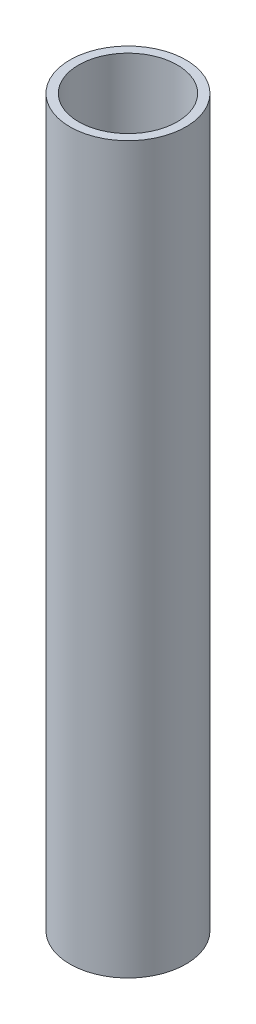
ISO-10303-21;
HEADER;
FILE_DESCRIPTION(('STEP AP214'),'2;1');
FILE_NAME('part.step','',(''),(''),'','','');
FILE_SCHEMA(('AUTOMOTIVE_DESIGN { 1 0 10303 214 1 1 1 1 }'));
ENDSEC;
DATA;
#1=APPLICATION_CONTEXT('core data for automotive mechanical design processes');
#2=APPLICATION_PROTOCOL_DEFINITION('international standard','automotive_design',2000,#1);
#3=PRODUCT_CONTEXT('',#1,'mechanical');
#4=PRODUCT('Part','Part','',(#3));
#5=PRODUCT_RELATED_PRODUCT_CATEGORY('part','',(#4));
#6=PRODUCT_DEFINITION_FORMATION('','',#4);
#7=PRODUCT_DEFINITION_CONTEXT('part definition',#1,'design');
#8=PRODUCT_DEFINITION('design','',#6,#7);
#9=PRODUCT_DEFINITION_SHAPE('','',#8);
#10=(LENGTH_UNIT() NAMED_UNIT(*) SI_UNIT(.MILLI.,.METRE.));
#11=(NAMED_UNIT(*) PLANE_ANGLE_UNIT() SI_UNIT($,.RADIAN.));
#12=(NAMED_UNIT(*) SI_UNIT($,.STERADIAN.) SOLID_ANGLE_UNIT());
#13=UNCERTAINTY_MEASURE_WITH_UNIT(LENGTH_MEASURE(1.E-05),#10,'distance_accuracy_value','');
#14=(GEOMETRIC_REPRESENTATION_CONTEXT(3) GLOBAL_UNCERTAINTY_ASSIGNED_CONTEXT((#13)) GLOBAL_UNIT_ASSIGNED_CONTEXT((#10,
#11,#12)) REPRESENTATION_CONTEXT('',''));
#15=CARTESIAN_POINT('',(0.,0.,0.));
#16=DIRECTION('',(0.,0.,1.));
#17=DIRECTION('',(1.,0.,0.));
#18=AXIS2_PLACEMENT_3D('',#15,#16,#17);
#19=CARTESIAN_POINT('',(0.,200.,0.));
#20=DIRECTION('',(0.,1.,0.));
#21=DIRECTION('',(0.,0.,1.));
#22=AXIS2_PLACEMENT_3D('',#19,#20,#21);
#23=PLANE('',#22);
#24=CARTESIAN_POINT('',(0.,200.,0.));
#25=DIRECTION('',(0.,1.,0.));
#26=DIRECTION('',(0.,0.,1.));
#27=AXIS2_PLACEMENT_3D('',#24,#25,#26);
#28=CIRCLE('',#27,16.);
#29=CARTESIAN_POINT('',(0.,200.,16.));
#30=VERTEX_POINT('',#29);
#31=EDGE_CURVE('E10',#30,#30,#28,.T.);
#32=ORIENTED_EDGE('',*,*,#31,.T.);
#33=EDGE_LOOP('',(#32));
#34=FACE_BOUND('',#33,.T.);
#35=CARTESIAN_POINT('',(0.,200.,0.));
#36=DIRECTION('',(0.,1.,0.));
#37=DIRECTION('',(0.,0.,1.));
#38=AXIS2_PLACEMENT_3D('',#35,#36,#37);
#39=CIRCLE('',#38,13.6);
#40=CARTESIAN_POINT('',(0.,200.,13.6));
#41=VERTEX_POINT('',#40);
#42=EDGE_CURVE('E48',#41,#41,#39,.T.);
#43=ORIENTED_EDGE('',*,*,#42,.F.);
#44=EDGE_LOOP('',(#43));
#45=FACE_BOUND('',#44,.T.);
#46=ADVANCED_FACE('F37',(#34,#45),#23,.T.);
#47=CARTESIAN_POINT('',(0.,0.,0.));
#48=DIRECTION('',(0.,1.,0.));
#49=DIRECTION('',(0.,0.,1.));
#50=AXIS2_PLACEMENT_3D('',#47,#48,#49);
#51=PLANE('',#50);
#52=CARTESIAN_POINT('',(0.,0.,0.));
#53=DIRECTION('',(0.,1.,0.));
#54=DIRECTION('',(0.,0.,1.));
#55=AXIS2_PLACEMENT_3D('',#52,#53,#54);
#56=CIRCLE('',#55,16.);
#57=CARTESIAN_POINT('',(0.,0.,16.));
#58=VERTEX_POINT('',#57);
#59=EDGE_CURVE('E41',#58,#58,#56,.T.);
#60=ORIENTED_EDGE('',*,*,#59,.F.);
#61=EDGE_LOOP('',(#60));
#62=FACE_BOUND('',#61,.T.);
#63=CARTESIAN_POINT('',(0.,0.,0.));
#64=DIRECTION('',(0.,1.,0.));
#65=DIRECTION('',(0.,0.,1.));
#66=AXIS2_PLACEMENT_3D('',#63,#64,#65);
#67=CIRCLE('',#66,13.6);
#68=CARTESIAN_POINT('',(0.,0.,13.6));
#69=VERTEX_POINT('',#68);
#70=EDGE_CURVE('E50',#69,#69,#67,.T.);
#71=ORIENTED_EDGE('',*,*,#70,.T.);
#72=EDGE_LOOP('',(#71));
#73=FACE_BOUND('',#72,.T.);
#74=ADVANCED_FACE('F60',(#62,#73),#51,.F.);
#75=CARTESIAN_POINT('',(0.,200.,0.));
#76=DIRECTION('',(0.,-1.,0.));
#77=DIRECTION('',(0.,0.,-1.));
#78=AXIS2_PLACEMENT_3D('',#75,#76,#77);
#79=CYLINDRICAL_SURFACE('',#78,16.);
#80=ORIENTED_EDGE('',*,*,#31,.F.);
#81=EDGE_LOOP('',(#80));
#82=FACE_BOUND('',#81,.T.);
#83=ORIENTED_EDGE('',*,*,#59,.T.);
#84=EDGE_LOOP('',(#83));
#85=FACE_BOUND('',#84,.T.);
#86=ADVANCED_FACE('F39',(#82,#85),#79,.T.);
#87=CARTESIAN_POINT('',(0.,200.,0.));
#88=DIRECTION('',(0.,-1.,0.));
#89=DIRECTION('',(0.,0.,-1.));
#90=AXIS2_PLACEMENT_3D('',#87,#88,#89);
#91=CYLINDRICAL_SURFACE('',#90,13.6);
#92=ORIENTED_EDGE('',*,*,#42,.T.);
#93=EDGE_LOOP('',(#92));
#94=FACE_BOUND('',#93,.T.);
#95=ORIENTED_EDGE('',*,*,#70,.F.);
#96=EDGE_LOOP('',(#95));
#97=FACE_BOUND('',#96,.T.);
#98=ADVANCED_FACE('F56',(#94,#97),#91,.F.);
#99=CLOSED_SHELL('',(#46,#74,#86,#98));
#100=MANIFOLD_SOLID_BREP('B2',#99);
#101=ADVANCED_BREP_SHAPE_REPRESENTATION('',(#18,#100),#14);
#102=SHAPE_DEFINITION_REPRESENTATION(#9,#101);
ENDSEC;
END-ISO-10303-21;
